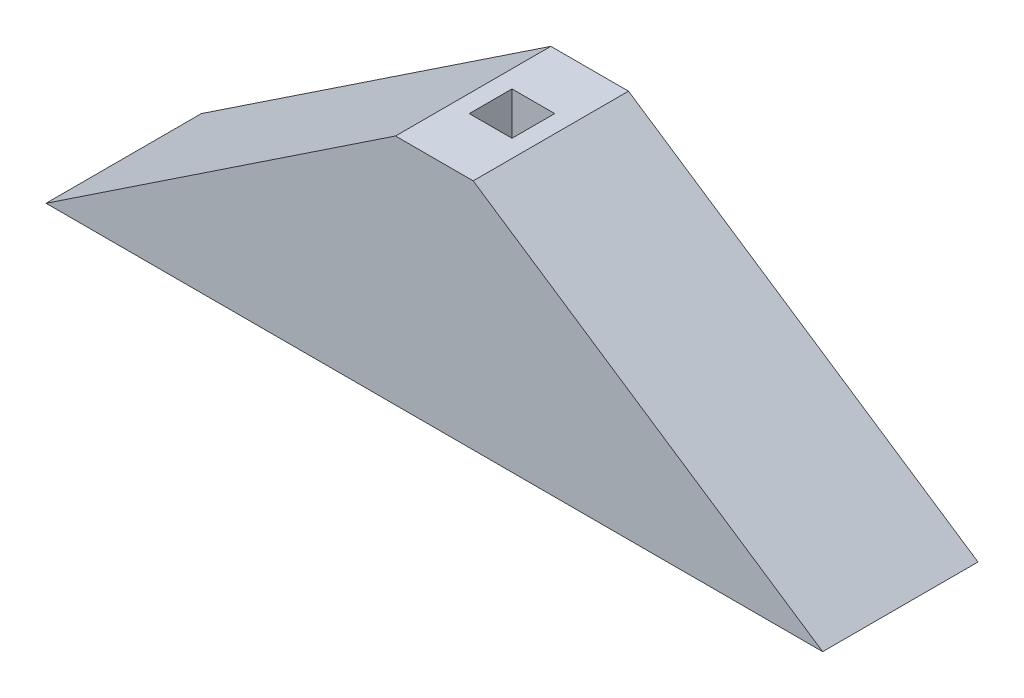
ISO-10303-21;
HEADER;
FILE_DESCRIPTION(('STEP AP214'),'2;1');
FILE_NAME('part.step','',(''),(''),'','','');
FILE_SCHEMA(('AUTOMOTIVE_DESIGN { 1 0 10303 214 1 1 1 1 }'));
ENDSEC;
DATA;
#1=APPLICATION_CONTEXT('core data for automotive mechanical design processes');
#2=APPLICATION_PROTOCOL_DEFINITION('international standard','automotive_design',2000,#1);
#3=PRODUCT_CONTEXT('',#1,'mechanical');
#4=PRODUCT('Part','Part','',(#3));
#5=PRODUCT_RELATED_PRODUCT_CATEGORY('part','',(#4));
#6=PRODUCT_DEFINITION_FORMATION('','',#4);
#7=PRODUCT_DEFINITION_CONTEXT('part definition',#1,'design');
#8=PRODUCT_DEFINITION('design','',#6,#7);
#9=PRODUCT_DEFINITION_SHAPE('','',#8);
#10=(LENGTH_UNIT() NAMED_UNIT(*) SI_UNIT(.MILLI.,.METRE.));
#11=(NAMED_UNIT(*) PLANE_ANGLE_UNIT() SI_UNIT($,.RADIAN.));
#12=(NAMED_UNIT(*) SI_UNIT($,.STERADIAN.) SOLID_ANGLE_UNIT());
#13=UNCERTAINTY_MEASURE_WITH_UNIT(LENGTH_MEASURE(1.E-05),#10,'distance_accuracy_value','');
#14=(GEOMETRIC_REPRESENTATION_CONTEXT(3) GLOBAL_UNCERTAINTY_ASSIGNED_CONTEXT((#13)) GLOBAL_UNIT_ASSIGNED_CONTEXT((#10,
#11,#12)) REPRESENTATION_CONTEXT('',''));
#15=CARTESIAN_POINT('',(0.,0.,0.));
#16=DIRECTION('',(0.,0.,1.));
#17=DIRECTION('',(1.,0.,0.));
#18=AXIS2_PLACEMENT_3D('',#15,#16,#17);
#19=CARTESIAN_POINT('',(-12.7,76.2,50.8));
#20=DIRECTION('',(0.554700196225229,-0.832050294337844,0.));
#21=DIRECTION('',(0.832050294337844,0.554700196225229,0.));
#22=AXIS2_PLACEMENT_3D('',#19,#20,#21);
#23=PLANE('',#22);
#24=DIRECTION('',(-0.832050294337844,-0.554700196225229,0.));
#25=VECTOR('',#24,1.);
#26=CARTESIAN_POINT('',(-12.7,76.2,0.));
#27=LINE('',#26,#25);
#28=CARTESIAN_POINT('',(-12.7,76.2,0.));
#29=VERTEX_POINT('',#28);
#30=CARTESIAN_POINT('',(-127.,0.,0.));
#31=VERTEX_POINT('',#30);
#32=EDGE_CURVE('E140',#29,#31,#27,.T.);
#33=ORIENTED_EDGE('',*,*,#32,.T.);
#34=DIRECTION('',(0.,0.,-1.));
#35=VECTOR('',#34,1.);
#36=CARTESIAN_POINT('',(-127.,0.,50.8));
#37=LINE('',#36,#35);
#38=CARTESIAN_POINT('',(-127.,0.,50.8));
#39=VERTEX_POINT('',#38);
#40=EDGE_CURVE('E11',#39,#31,#37,.T.);
#41=ORIENTED_EDGE('',*,*,#40,.F.);
#42=DIRECTION('',(-0.832050294337844,-0.554700196225229,0.));
#43=VECTOR('',#42,1.);
#44=CARTESIAN_POINT('',(-12.7,76.2,50.8));
#45=LINE('',#44,#43);
#46=CARTESIAN_POINT('',(-12.7,76.2,50.8));
#47=VERTEX_POINT('',#46);
#48=EDGE_CURVE('E144',#47,#39,#45,.T.);
#49=ORIENTED_EDGE('',*,*,#48,.F.);
#50=DIRECTION('',(0.,0.,-1.));
#51=VECTOR('',#50,1.);
#52=CARTESIAN_POINT('',(-12.7,76.2,50.8));
#53=LINE('',#52,#51);
#54=EDGE_CURVE('E150',#47,#29,#53,.T.);
#55=ORIENTED_EDGE('',*,*,#54,.T.);
#56=EDGE_LOOP('',(#33,#41,#49,#55));
#57=FACE_BOUND('',#56,.T.);
#58=ADVANCED_FACE('F32',(#57),#23,.F.);
#59=CARTESIAN_POINT('',(-127.,0.,50.8));
#60=DIRECTION('',(0.,1.,0.));
#61=DIRECTION('',(-1.,0.,0.));
#62=AXIS2_PLACEMENT_3D('',#59,#60,#61);
#63=PLANE('',#62);
#64=DIRECTION('',(1.,0.,0.));
#65=VECTOR('',#64,1.);
#66=CARTESIAN_POINT('',(-127.,0.,0.));
#67=LINE('',#66,#65);
#68=CARTESIAN_POINT('',(127.,0.,0.));
#69=VERTEX_POINT('',#68);
#70=EDGE_CURVE('E153',#31,#69,#67,.T.);
#71=ORIENTED_EDGE('',*,*,#70,.T.);
#72=DIRECTION('',(0.,0.,-1.));
#73=VECTOR('',#72,1.);
#74=CARTESIAN_POINT('',(127.,0.,50.8));
#75=LINE('',#74,#73);
#76=CARTESIAN_POINT('',(127.,0.,50.8));
#77=VERTEX_POINT('',#76);
#78=EDGE_CURVE('E39',#77,#69,#75,.T.);
#79=ORIENTED_EDGE('',*,*,#78,.F.);
#80=DIRECTION('',(1.,0.,0.));
#81=VECTOR('',#80,1.);
#82=CARTESIAN_POINT('',(-127.,0.,50.8));
#83=LINE('',#82,#81);
#84=EDGE_CURVE('E83',#39,#77,#83,.T.);
#85=ORIENTED_EDGE('',*,*,#84,.F.);
#86=ORIENTED_EDGE('',*,*,#40,.T.);
#87=EDGE_LOOP('',(#71,#79,#85,#86));
#88=FACE_BOUND('',#87,.T.);
#89=ADVANCED_FACE('F182',(#88),#63,.F.);
#90=CARTESIAN_POINT('',(127.,0.,50.8));
#91=DIRECTION('',(-0.554700196225229,-0.832050294337844,0.));
#92=DIRECTION('',(0.832050294337844,-0.554700196225229,0.));
#93=AXIS2_PLACEMENT_3D('',#90,#91,#92);
#94=PLANE('',#93);
#95=DIRECTION('',(-0.832050294337844,0.554700196225229,0.));
#96=VECTOR('',#95,1.);
#97=CARTESIAN_POINT('',(127.,0.,0.));
#98=LINE('',#97,#96);
#99=CARTESIAN_POINT('',(12.7,76.2,0.));
#100=VERTEX_POINT('',#99);
#101=EDGE_CURVE('E155',#69,#100,#98,.T.);
#102=ORIENTED_EDGE('',*,*,#101,.T.);
#103=DIRECTION('',(0.,0.,-1.));
#104=VECTOR('',#103,1.);
#105=CARTESIAN_POINT('',(12.7,76.2,50.8));
#106=LINE('',#105,#104);
#107=CARTESIAN_POINT('',(12.7,76.2,50.8));
#108=VERTEX_POINT('',#107);
#109=EDGE_CURVE('E159',#108,#100,#106,.T.);
#110=ORIENTED_EDGE('',*,*,#109,.F.);
#111=DIRECTION('',(-0.832050294337844,0.554700196225229,0.));
#112=VECTOR('',#111,1.);
#113=CARTESIAN_POINT('',(127.,0.,50.8));
#114=LINE('',#113,#112);
#115=EDGE_CURVE('E147',#77,#108,#114,.T.);
#116=ORIENTED_EDGE('',*,*,#115,.F.);
#117=ORIENTED_EDGE('',*,*,#78,.T.);
#118=EDGE_LOOP('',(#102,#110,#116,#117));
#119=FACE_BOUND('',#118,.T.);
#120=ADVANCED_FACE('F164',(#119),#94,.F.);
#121=CARTESIAN_POINT('',(12.7,76.2,50.8));
#122=DIRECTION('',(0.,-1.,0.));
#123=DIRECTION('',(0.,0.,-1.));
#124=AXIS2_PLACEMENT_3D('',#121,#122,#123);
#125=PLANE('',#124);
#126=DIRECTION('',(-1.,0.,0.));
#127=VECTOR('',#126,1.);
#128=CARTESIAN_POINT('',(-6.98500000000002,76.2,18.415));
#129=LINE('',#128,#127);
#130=CARTESIAN_POINT('',(6.98499999999999,76.2,18.415));
#131=VERTEX_POINT('',#130);
#132=CARTESIAN_POINT('',(-6.98500000000002,76.2,18.415));
#133=VERTEX_POINT('',#132);
#134=EDGE_CURVE('E134',#131,#133,#129,.T.);
#135=ORIENTED_EDGE('',*,*,#134,.F.);
#136=DIRECTION('',(0.,0.,-1.));
#137=VECTOR('',#136,1.);
#138=CARTESIAN_POINT('',(6.98499999999999,76.2,32.385));
#139=LINE('',#138,#137);
#140=CARTESIAN_POINT('',(6.98499999999999,76.2,32.385));
#141=VERTEX_POINT('',#140);
#142=EDGE_CURVE('E46',#141,#131,#139,.T.);
#143=ORIENTED_EDGE('',*,*,#142,.F.);
#144=DIRECTION('',(1.,0.,0.));
#145=VECTOR('',#144,1.);
#146=CARTESIAN_POINT('',(-6.98500000000002,76.2,32.385));
#147=LINE('',#146,#145);
#148=CARTESIAN_POINT('',(-6.98500000000002,76.2,32.385));
#149=VERTEX_POINT('',#148);
#150=EDGE_CURVE('E125',#149,#141,#147,.T.);
#151=ORIENTED_EDGE('',*,*,#150,.F.);
#152=DIRECTION('',(0.,0.,1.));
#153=VECTOR('',#152,1.);
#154=CARTESIAN_POINT('',(-6.98500000000002,76.2,32.385));
#155=LINE('',#154,#153);
#156=EDGE_CURVE('E128',#133,#149,#155,.T.);
#157=ORIENTED_EDGE('',*,*,#156,.F.);
#158=EDGE_LOOP('',(#135,#143,#151,#157));
#159=FACE_BOUND('',#158,.T.);
#160=DIRECTION('',(-1.,0.,0.));
#161=VECTOR('',#160,1.);
#162=CARTESIAN_POINT('',(12.7,76.2,0.));
#163=LINE('',#162,#161);
#164=EDGE_CURVE('E76',#100,#29,#163,.T.);
#165=ORIENTED_EDGE('',*,*,#164,.T.);
#166=ORIENTED_EDGE('',*,*,#54,.F.);
#167=DIRECTION('',(-1.,0.,0.));
#168=VECTOR('',#167,1.);
#169=CARTESIAN_POINT('',(12.7,76.2,50.8));
#170=LINE('',#169,#168);
#171=EDGE_CURVE('E55',#108,#47,#170,.T.);
#172=ORIENTED_EDGE('',*,*,#171,.F.);
#173=ORIENTED_EDGE('',*,*,#109,.T.);
#174=EDGE_LOOP('',(#165,#166,#172,#173));
#175=FACE_BOUND('',#174,.T.);
#176=ADVANCED_FACE('F172',(#159,#175),#125,.F.);
#177=CARTESIAN_POINT('',(0.,0.,50.8));
#178=DIRECTION('',(0.,0.,-1.));
#179=DIRECTION('',(-1.,0.,0.));
#180=AXIS2_PLACEMENT_3D('',#177,#178,#179);
#181=PLANE('',#180);
#182=ORIENTED_EDGE('',*,*,#48,.T.);
#183=ORIENTED_EDGE('',*,*,#84,.T.);
#184=ORIENTED_EDGE('',*,*,#115,.T.);
#185=ORIENTED_EDGE('',*,*,#171,.T.);
#186=EDGE_LOOP('',(#182,#183,#184,#185));
#187=FACE_BOUND('',#186,.T.);
#188=ADVANCED_FACE('F174',(#187),#181,.F.);
#189=CARTESIAN_POINT('',(0.,0.,0.));
#190=DIRECTION('',(0.,0.,-1.));
#191=DIRECTION('',(-1.,0.,0.));
#192=AXIS2_PLACEMENT_3D('',#189,#190,#191);
#193=PLANE('',#192);
#194=ORIENTED_EDGE('',*,*,#32,.F.);
#195=ORIENTED_EDGE('',*,*,#164,.F.);
#196=ORIENTED_EDGE('',*,*,#101,.F.);
#197=ORIENTED_EDGE('',*,*,#70,.F.);
#198=EDGE_LOOP('',(#194,#195,#196,#197));
#199=FACE_BOUND('',#198,.T.);
#200=ADVANCED_FACE('F168',(#199),#193,.T.);
#201=CARTESIAN_POINT('',(6.98499999999999,12.7,32.385));
#202=DIRECTION('',(1.,0.,0.));
#203=DIRECTION('',(0.,0.,-1.));
#204=AXIS2_PLACEMENT_3D('',#201,#202,#203);
#205=PLANE('',#204);
#206=ORIENTED_EDGE('',*,*,#142,.T.);
#207=DIRECTION('',(0.,1.,0.));
#208=VECTOR('',#207,1.);
#209=CARTESIAN_POINT('',(6.98499999999999,12.7,18.415));
#210=LINE('',#209,#208);
#211=CARTESIAN_POINT('',(6.98499999999999,12.7,18.415));
#212=VERTEX_POINT('',#211);
#213=EDGE_CURVE('E103',#212,#131,#210,.T.);
#214=ORIENTED_EDGE('',*,*,#213,.F.);
#215=DIRECTION('',(0.,0.,-1.));
#216=VECTOR('',#215,1.);
#217=CARTESIAN_POINT('',(6.98499999999999,12.7,32.385));
#218=LINE('',#217,#216);
#219=CARTESIAN_POINT('',(6.98499999999999,12.7,32.385));
#220=VERTEX_POINT('',#219);
#221=EDGE_CURVE('E107',#220,#212,#218,.T.);
#222=ORIENTED_EDGE('',*,*,#221,.F.);
#223=DIRECTION('',(0.,1.,0.));
#224=VECTOR('',#223,1.);
#225=CARTESIAN_POINT('',(6.98499999999999,12.7,32.385));
#226=LINE('',#225,#224);
#227=EDGE_CURVE('E138',#220,#141,#226,.T.);
#228=ORIENTED_EDGE('',*,*,#227,.T.);
#229=EDGE_LOOP('',(#206,#214,#222,#228));
#230=FACE_BOUND('',#229,.T.);
#231=ADVANCED_FACE('F105',(#230),#205,.F.);
#232=CARTESIAN_POINT('',(-6.98500000000002,12.7,32.385));
#233=DIRECTION('',(0.,0.,1.));
#234=DIRECTION('',(1.,0.,0.));
#235=AXIS2_PLACEMENT_3D('',#232,#233,#234);
#236=PLANE('',#235);
#237=ORIENTED_EDGE('',*,*,#150,.T.);
#238=ORIENTED_EDGE('',*,*,#227,.F.);
#239=DIRECTION('',(1.,0.,0.));
#240=VECTOR('',#239,1.);
#241=CARTESIAN_POINT('',(-6.98500000000002,12.7,32.385));
#242=LINE('',#241,#240);
#243=CARTESIAN_POINT('',(-6.98500000000002,12.7,32.385));
#244=VERTEX_POINT('',#243);
#245=EDGE_CURVE('E113',#244,#220,#242,.T.);
#246=ORIENTED_EDGE('',*,*,#245,.F.);
#247=DIRECTION('',(0.,1.,0.));
#248=VECTOR('',#247,1.);
#249=CARTESIAN_POINT('',(-6.98500000000002,12.7,32.385));
#250=LINE('',#249,#248);
#251=EDGE_CURVE('E141',#244,#149,#250,.T.);
#252=ORIENTED_EDGE('',*,*,#251,.T.);
#253=EDGE_LOOP('',(#237,#238,#246,#252));
#254=FACE_BOUND('',#253,.T.);
#255=ADVANCED_FACE('F221',(#254),#236,.F.);
#256=CARTESIAN_POINT('',(-6.98500000000002,12.7,32.385));
#257=DIRECTION('',(-1.,0.,0.));
#258=DIRECTION('',(0.,0.,1.));
#259=AXIS2_PLACEMENT_3D('',#256,#257,#258);
#260=PLANE('',#259);
#261=ORIENTED_EDGE('',*,*,#156,.T.);
#262=ORIENTED_EDGE('',*,*,#251,.F.);
#263=DIRECTION('',(0.,0.,1.));
#264=VECTOR('',#263,1.);
#265=CARTESIAN_POINT('',(-6.98500000000002,12.7,32.385));
#266=LINE('',#265,#264);
#267=CARTESIAN_POINT('',(-6.98500000000002,12.7,18.415));
#268=VERTEX_POINT('',#267);
#269=EDGE_CURVE('E121',#268,#244,#266,.T.);
#270=ORIENTED_EDGE('',*,*,#269,.F.);
#271=DIRECTION('',(0.,1.,0.));
#272=VECTOR('',#271,1.);
#273=CARTESIAN_POINT('',(-6.98500000000002,12.7,18.415));
#274=LINE('',#273,#272);
#275=EDGE_CURVE('E112',#268,#133,#274,.T.);
#276=ORIENTED_EDGE('',*,*,#275,.T.);
#277=EDGE_LOOP('',(#261,#262,#270,#276));
#278=FACE_BOUND('',#277,.T.);
#279=ADVANCED_FACE('F230',(#278),#260,.F.);
#280=CARTESIAN_POINT('',(-6.98500000000002,12.7,18.415));
#281=DIRECTION('',(0.,0.,-1.));
#282=DIRECTION('',(-1.,0.,0.));
#283=AXIS2_PLACEMENT_3D('',#280,#281,#282);
#284=PLANE('',#283);
#285=ORIENTED_EDGE('',*,*,#134,.T.);
#286=ORIENTED_EDGE('',*,*,#275,.F.);
#287=DIRECTION('',(-1.,0.,0.));
#288=VECTOR('',#287,1.);
#289=CARTESIAN_POINT('',(-6.98500000000002,12.7,18.415));
#290=LINE('',#289,#288);
#291=EDGE_CURVE('E116',#212,#268,#290,.T.);
#292=ORIENTED_EDGE('',*,*,#291,.F.);
#293=ORIENTED_EDGE('',*,*,#213,.T.);
#294=EDGE_LOOP('',(#285,#286,#292,#293));
#295=FACE_BOUND('',#294,.T.);
#296=ADVANCED_FACE('F117',(#295),#284,.F.);
#297=CARTESIAN_POINT('',(0.,12.7,0.));
#298=DIRECTION('',(0.,-1.,0.));
#299=DIRECTION('',(0.,0.,-1.));
#300=AXIS2_PLACEMENT_3D('',#297,#298,#299);
#301=PLANE('',#300);
#302=ORIENTED_EDGE('',*,*,#221,.T.);
#303=ORIENTED_EDGE('',*,*,#291,.T.);
#304=ORIENTED_EDGE('',*,*,#269,.T.);
#305=ORIENTED_EDGE('',*,*,#245,.T.);
#306=EDGE_LOOP('',(#302,#303,#304,#305));
#307=FACE_BOUND('',#306,.T.);
#308=ADVANCED_FACE('F123',(#307),#301,.F.);
#309=CLOSED_SHELL('',(#58,#89,#120,#176,#188,#200,#231,#255,#279,#296,#308));
#310=MANIFOLD_SOLID_BREP('B2',#309);
#311=ADVANCED_BREP_SHAPE_REPRESENTATION('',(#18,#310),#14);
#312=SHAPE_DEFINITION_REPRESENTATION(#9,#311);
ENDSEC;
END-ISO-10303-21;
